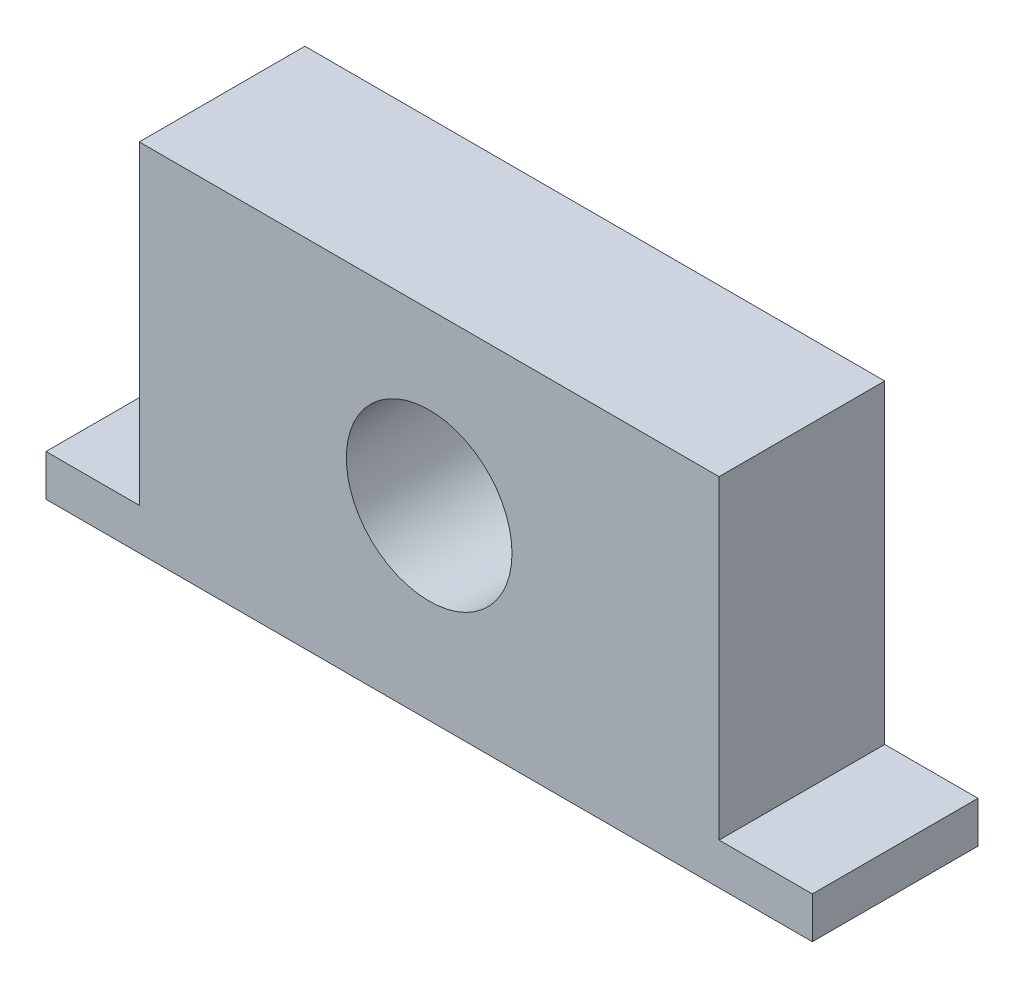
ISO-10303-21;
HEADER;
FILE_DESCRIPTION(('STEP AP214'),'2;1');
FILE_NAME('part.step','',(''),(''),'','','');
FILE_SCHEMA(('AUTOMOTIVE_DESIGN { 1 0 10303 214 1 1 1 1 }'));
ENDSEC;
DATA;
#1=APPLICATION_CONTEXT('core data for automotive mechanical design processes');
#2=APPLICATION_PROTOCOL_DEFINITION('international standard','automotive_design',2000,#1);
#3=PRODUCT_CONTEXT('',#1,'mechanical');
#4=PRODUCT('Part','Part','',(#3));
#5=PRODUCT_RELATED_PRODUCT_CATEGORY('part','',(#4));
#6=PRODUCT_DEFINITION_FORMATION('','',#4);
#7=PRODUCT_DEFINITION_CONTEXT('part definition',#1,'design');
#8=PRODUCT_DEFINITION('design','',#6,#7);
#9=PRODUCT_DEFINITION_SHAPE('','',#8);
#10=(LENGTH_UNIT() NAMED_UNIT(*) SI_UNIT(.MILLI.,.METRE.));
#11=(NAMED_UNIT(*) PLANE_ANGLE_UNIT() SI_UNIT($,.RADIAN.));
#12=(NAMED_UNIT(*) SI_UNIT($,.STERADIAN.) SOLID_ANGLE_UNIT());
#13=UNCERTAINTY_MEASURE_WITH_UNIT(LENGTH_MEASURE(1.E-05),#10,'distance_accuracy_value','');
#14=(GEOMETRIC_REPRESENTATION_CONTEXT(3) GLOBAL_UNCERTAINTY_ASSIGNED_CONTEXT((#13)) GLOBAL_UNIT_ASSIGNED_CONTEXT((#10,
#11,#12)) REPRESENTATION_CONTEXT('',''));
#15=CARTESIAN_POINT('',(0.,0.,0.));
#16=DIRECTION('',(0.,0.,1.));
#17=DIRECTION('',(1.,0.,0.));
#18=AXIS2_PLACEMENT_3D('',#15,#16,#17);
#19=CARTESIAN_POINT('',(0.,3.175,0.));
#20=DIRECTION('',(0.,-1.,0.));
#21=DIRECTION('',(0.,0.,-1.));
#22=AXIS2_PLACEMENT_3D('',#19,#20,#21);
#23=PLANE('',#22);
#24=DIRECTION('',(0.,0.,1.));
#25=VECTOR('',#24,1.);
#26=CARTESIAN_POINT('',(7.1501,3.175,0.));
#27=LINE('',#26,#25);
#28=CARTESIAN_POINT('',(7.1501,3.175,-12.7));
#29=VERTEX_POINT('',#28);
#30=CARTESIAN_POINT('',(7.1501,3.175,0.));
#31=VERTEX_POINT('',#30);
#32=EDGE_CURVE('E50',#29,#31,#27,.T.);
#33=ORIENTED_EDGE('',*,*,#32,.F.);
#34=DIRECTION('',(-1.,0.,0.));
#35=VECTOR('',#34,1.);
#36=CARTESIAN_POINT('',(0.,3.175,-12.7));
#37=LINE('',#36,#35);
#38=CARTESIAN_POINT('',(0.,3.175,-12.7));
#39=VERTEX_POINT('',#38);
#40=EDGE_CURVE('E147',#29,#39,#37,.T.);
#41=ORIENTED_EDGE('',*,*,#40,.T.);
#42=DIRECTION('',(0.,0.,1.));
#43=VECTOR('',#42,1.);
#44=CARTESIAN_POINT('',(0.,3.175,0.));
#45=LINE('',#44,#43);
#46=CARTESIAN_POINT('',(0.,3.175,0.));
#47=VERTEX_POINT('',#46);
#48=EDGE_CURVE('E142',#39,#47,#45,.T.);
#49=ORIENTED_EDGE('',*,*,#48,.T.);
#50=DIRECTION('',(1.,0.,0.));
#51=VECTOR('',#50,1.);
#52=CARTESIAN_POINT('',(0.,3.175,0.));
#53=LINE('',#52,#51);
#54=EDGE_CURVE('E213',#47,#31,#53,.T.);
#55=ORIENTED_EDGE('',*,*,#54,.T.);
#56=EDGE_LOOP('',(#33,#41,#49,#55));
#57=FACE_BOUND('',#56,.T.);
#58=ADVANCED_FACE('F33',(#57),#23,.F.);
#59=DIRECTION('',(0.,0.,-1.));
#60=VECTOR('',#59,1.);
#61=CARTESIAN_POINT('',(51.6001,3.175,0.));
#62=LINE('',#61,#60);
#63=CARTESIAN_POINT('',(51.6001,3.175,0.));
#64=VERTEX_POINT('',#63);
#65=CARTESIAN_POINT('',(51.6001,3.175,-12.7));
#66=VERTEX_POINT('',#65);
#67=EDGE_CURVE('E58',#64,#66,#62,.T.);
#68=ORIENTED_EDGE('',*,*,#67,.F.);
#69=CARTESIAN_POINT('',(58.7502,3.175,0.));
#70=VERTEX_POINT('',#69);
#71=EDGE_CURVE('E216',#64,#70,#53,.T.);
#72=ORIENTED_EDGE('',*,*,#71,.T.);
#73=DIRECTION('',(0.,0.,-1.));
#74=VECTOR('',#73,1.);
#75=CARTESIAN_POINT('',(58.7502,3.175,0.));
#76=LINE('',#75,#74);
#77=CARTESIAN_POINT('',(58.7502,3.175,-12.7));
#78=VERTEX_POINT('',#77);
#79=EDGE_CURVE('E215',#70,#78,#76,.T.);
#80=ORIENTED_EDGE('',*,*,#79,.T.);
#81=EDGE_CURVE('E225',#78,#66,#37,.T.);
#82=ORIENTED_EDGE('',*,*,#81,.T.);
#83=EDGE_LOOP('',(#68,#72,#80,#82));
#84=FACE_BOUND('',#83,.T.);
#85=ADVANCED_FACE('F175',(#84),#23,.F.);
#86=CARTESIAN_POINT('',(0.,3.175,0.));
#87=DIRECTION('',(1.,0.,0.));
#88=DIRECTION('',(0.,0.,-1.));
#89=AXIS2_PLACEMENT_3D('',#86,#87,#88);
#90=PLANE('',#89);
#91=DIRECTION('',(0.,0.,1.));
#92=VECTOR('',#91,1.);
#93=CARTESIAN_POINT('',(0.,0.,0.));
#94=LINE('',#93,#92);
#95=CARTESIAN_POINT('',(0.,0.,-12.7));
#96=VERTEX_POINT('',#95);
#97=CARTESIAN_POINT('',(0.,0.,0.));
#98=VERTEX_POINT('',#97);
#99=EDGE_CURVE('E121',#96,#98,#94,.T.);
#100=ORIENTED_EDGE('',*,*,#99,.T.);
#101=DIRECTION('',(0.,-1.,0.));
#102=VECTOR('',#101,1.);
#103=CARTESIAN_POINT('',(0.,3.175,0.));
#104=LINE('',#103,#102);
#105=EDGE_CURVE('E11',#47,#98,#104,.T.);
#106=ORIENTED_EDGE('',*,*,#105,.F.);
#107=ORIENTED_EDGE('',*,*,#48,.F.);
#108=DIRECTION('',(0.,-1.,0.));
#109=VECTOR('',#108,1.);
#110=CARTESIAN_POINT('',(0.,3.175,-12.7));
#111=LINE('',#110,#109);
#112=EDGE_CURVE('E205',#39,#96,#111,.T.);
#113=ORIENTED_EDGE('',*,*,#112,.T.);
#114=EDGE_LOOP('',(#100,#106,#107,#113));
#115=FACE_BOUND('',#114,.T.);
#116=ADVANCED_FACE('F35',(#115),#90,.F.);
#117=CARTESIAN_POINT('',(0.,3.175,0.));
#118=DIRECTION('',(0.,0.,-1.));
#119=DIRECTION('',(-1.,0.,0.));
#120=AXIS2_PLACEMENT_3D('',#117,#118,#119);
#121=PLANE('',#120);
#122=CARTESIAN_POINT('',(29.3751,14.2748,0.));
#123=DIRECTION('',(0.,0.,1.));
#124=DIRECTION('',(1.,0.,0.));
#125=AXIS2_PLACEMENT_3D('',#122,#123,#124);
#126=CIRCLE('',#125,6.35);
#127=CARTESIAN_POINT('',(35.7251,14.2748,0.));
#128=VERTEX_POINT('',#127);
#129=EDGE_CURVE('E157',#128,#128,#126,.T.);
#130=ORIENTED_EDGE('',*,*,#129,.F.);
#131=EDGE_LOOP('',(#130));
#132=FACE_BOUND('',#131,.T.);
#133=DIRECTION('',(1.,0.,0.));
#134=VECTOR('',#133,1.);
#135=CARTESIAN_POINT('',(0.,0.,0.));
#136=LINE('',#135,#134);
#137=CARTESIAN_POINT('',(58.7502,0.,0.));
#138=VERTEX_POINT('',#137);
#139=EDGE_CURVE('E124',#98,#138,#136,.T.);
#140=ORIENTED_EDGE('',*,*,#139,.T.);
#141=DIRECTION('',(0.,-1.,0.));
#142=VECTOR('',#141,1.);
#143=CARTESIAN_POINT('',(58.7502,3.175,0.));
#144=LINE('',#143,#142);
#145=EDGE_CURVE('E42',#70,#138,#144,.T.);
#146=ORIENTED_EDGE('',*,*,#145,.F.);
#147=ORIENTED_EDGE('',*,*,#71,.F.);
#148=DIRECTION('',(0.,-1.,0.));
#149=VECTOR('',#148,1.);
#150=CARTESIAN_POINT('',(51.6001,27.305,0.));
#151=LINE('',#150,#149);
#152=CARTESIAN_POINT('',(51.6001,27.305,0.));
#153=VERTEX_POINT('',#152);
#154=EDGE_CURVE('E106',#153,#64,#151,.T.);
#155=ORIENTED_EDGE('',*,*,#154,.F.);
#156=DIRECTION('',(1.,0.,0.));
#157=VECTOR('',#156,1.);
#158=CARTESIAN_POINT('',(7.1501,27.305,0.));
#159=LINE('',#158,#157);
#160=CARTESIAN_POINT('',(7.1501,27.305,0.));
#161=VERTEX_POINT('',#160);
#162=EDGE_CURVE('E100',#161,#153,#159,.T.);
#163=ORIENTED_EDGE('',*,*,#162,.F.);
#164=DIRECTION('',(0.,-1.,0.));
#165=VECTOR('',#164,1.);
#166=CARTESIAN_POINT('',(7.1501,27.305,0.));
#167=LINE('',#166,#165);
#168=EDGE_CURVE('E104',#161,#31,#167,.T.);
#169=ORIENTED_EDGE('',*,*,#168,.T.);
#170=ORIENTED_EDGE('',*,*,#54,.F.);
#171=ORIENTED_EDGE('',*,*,#105,.T.);
#172=EDGE_LOOP('',(#140,#146,#147,#155,#163,#169,#170,#171));
#173=FACE_BOUND('',#172,.T.);
#174=ADVANCED_FACE('F102',(#132,#173),#121,.F.);
#175=CARTESIAN_POINT('',(58.7502,3.175,0.));
#176=DIRECTION('',(-1.,0.,0.));
#177=DIRECTION('',(0.,0.,1.));
#178=AXIS2_PLACEMENT_3D('',#175,#176,#177);
#179=PLANE('',#178);
#180=DIRECTION('',(0.,0.,-1.));
#181=VECTOR('',#180,1.);
#182=CARTESIAN_POINT('',(58.7502,0.,0.));
#183=LINE('',#182,#181);
#184=CARTESIAN_POINT('',(58.7502,0.,-12.7));
#185=VERTEX_POINT('',#184);
#186=EDGE_CURVE('E209',#138,#185,#183,.T.);
#187=ORIENTED_EDGE('',*,*,#186,.T.);
#188=DIRECTION('',(0.,-1.,0.));
#189=VECTOR('',#188,1.);
#190=CARTESIAN_POINT('',(58.7502,3.175,-12.7));
#191=LINE('',#190,#189);
#192=EDGE_CURVE('E224',#78,#185,#191,.T.);
#193=ORIENTED_EDGE('',*,*,#192,.F.);
#194=ORIENTED_EDGE('',*,*,#79,.F.);
#195=ORIENTED_EDGE('',*,*,#145,.T.);
#196=EDGE_LOOP('',(#187,#193,#194,#195));
#197=FACE_BOUND('',#196,.T.);
#198=ADVANCED_FACE('F189',(#197),#179,.F.);
#199=CARTESIAN_POINT('',(0.,3.175,-12.7));
#200=DIRECTION('',(0.,0.,1.));
#201=DIRECTION('',(1.,0.,0.));
#202=AXIS2_PLACEMENT_3D('',#199,#200,#201);
#203=PLANE('',#202);
#204=CARTESIAN_POINT('',(29.3751,14.2748,-12.7));
#205=DIRECTION('',(0.,0.,1.));
#206=DIRECTION('',(1.,0.,0.));
#207=AXIS2_PLACEMENT_3D('',#204,#205,#206);
#208=CIRCLE('',#207,6.35);
#209=CARTESIAN_POINT('',(35.7251,14.2748,-12.7));
#210=VERTEX_POINT('',#209);
#211=EDGE_CURVE('E37',#210,#210,#208,.T.);
#212=ORIENTED_EDGE('',*,*,#211,.T.);
#213=EDGE_LOOP('',(#212));
#214=FACE_BOUND('',#213,.T.);
#215=DIRECTION('',(-1.,0.,0.));
#216=VECTOR('',#215,1.);
#217=CARTESIAN_POINT('',(0.,0.,-12.7));
#218=LINE('',#217,#216);
#219=EDGE_CURVE('E208',#185,#96,#218,.T.);
#220=ORIENTED_EDGE('',*,*,#219,.T.);
#221=ORIENTED_EDGE('',*,*,#112,.F.);
#222=ORIENTED_EDGE('',*,*,#40,.F.);
#223=DIRECTION('',(0.,-1.,0.));
#224=VECTOR('',#223,1.);
#225=CARTESIAN_POINT('',(7.1501,27.305,-12.7));
#226=LINE('',#225,#224);
#227=CARTESIAN_POINT('',(7.1501,27.305,-12.7));
#228=VERTEX_POINT('',#227);
#229=EDGE_CURVE('E135',#228,#29,#226,.T.);
#230=ORIENTED_EDGE('',*,*,#229,.F.);
#231=DIRECTION('',(-1.,0.,0.));
#232=VECTOR('',#231,1.);
#233=CARTESIAN_POINT('',(7.1501,27.305,-12.7));
#234=LINE('',#233,#232);
#235=CARTESIAN_POINT('',(51.6001,27.305,-12.7));
#236=VERTEX_POINT('',#235);
#237=EDGE_CURVE('E115',#236,#228,#234,.T.);
#238=ORIENTED_EDGE('',*,*,#237,.F.);
#239=DIRECTION('',(0.,-1.,0.));
#240=VECTOR('',#239,1.);
#241=CARTESIAN_POINT('',(51.6001,27.305,-12.7));
#242=LINE('',#241,#240);
#243=EDGE_CURVE('E126',#236,#66,#242,.T.);
#244=ORIENTED_EDGE('',*,*,#243,.T.);
#245=ORIENTED_EDGE('',*,*,#81,.F.);
#246=ORIENTED_EDGE('',*,*,#192,.T.);
#247=EDGE_LOOP('',(#220,#221,#222,#230,#238,#244,#245,#246));
#248=FACE_BOUND('',#247,.T.);
#249=ADVANCED_FACE('F164',(#214,#248),#203,.F.);
#250=CARTESIAN_POINT('',(0.,0.,0.));
#251=DIRECTION('',(0.,-1.,0.));
#252=DIRECTION('',(0.,0.,-1.));
#253=AXIS2_PLACEMENT_3D('',#250,#251,#252);
#254=PLANE('',#253);
#255=ORIENTED_EDGE('',*,*,#99,.F.);
#256=ORIENTED_EDGE('',*,*,#219,.F.);
#257=ORIENTED_EDGE('',*,*,#186,.F.);
#258=ORIENTED_EDGE('',*,*,#139,.F.);
#259=EDGE_LOOP('',(#255,#256,#257,#258));
#260=FACE_BOUND('',#259,.T.);
#261=ADVANCED_FACE('F183',(#260),#254,.T.);
#262=CARTESIAN_POINT('',(7.1501,27.305,0.));
#263=DIRECTION('',(1.,0.,0.));
#264=DIRECTION('',(0.,0.,-1.));
#265=AXIS2_PLACEMENT_3D('',#262,#263,#264);
#266=PLANE('',#265);
#267=ORIENTED_EDGE('',*,*,#32,.T.);
#268=ORIENTED_EDGE('',*,*,#168,.F.);
#269=DIRECTION('',(0.,0.,1.));
#270=VECTOR('',#269,1.);
#271=CARTESIAN_POINT('',(7.1501,27.305,0.));
#272=LINE('',#271,#270);
#273=EDGE_CURVE('E110',#228,#161,#272,.T.);
#274=ORIENTED_EDGE('',*,*,#273,.F.);
#275=ORIENTED_EDGE('',*,*,#229,.T.);
#276=EDGE_LOOP('',(#267,#268,#274,#275));
#277=FACE_BOUND('',#276,.T.);
#278=ADVANCED_FACE('F120',(#277),#266,.F.);
#279=CARTESIAN_POINT('',(51.6001,27.305,0.));
#280=DIRECTION('',(-1.,0.,0.));
#281=DIRECTION('',(0.,0.,1.));
#282=AXIS2_PLACEMENT_3D('',#279,#280,#281);
#283=PLANE('',#282);
#284=ORIENTED_EDGE('',*,*,#67,.T.);
#285=ORIENTED_EDGE('',*,*,#243,.F.);
#286=DIRECTION('',(0.,0.,-1.));
#287=VECTOR('',#286,1.);
#288=CARTESIAN_POINT('',(51.6001,27.305,0.));
#289=LINE('',#288,#287);
#290=EDGE_CURVE('E109',#153,#236,#289,.T.);
#291=ORIENTED_EDGE('',*,*,#290,.F.);
#292=ORIENTED_EDGE('',*,*,#154,.T.);
#293=EDGE_LOOP('',(#284,#285,#291,#292));
#294=FACE_BOUND('',#293,.T.);
#295=ADVANCED_FACE('F172',(#294),#283,.F.);
#296=CARTESIAN_POINT('',(0.,27.305,0.));
#297=DIRECTION('',(0.,-1.,0.));
#298=DIRECTION('',(0.,0.,-1.));
#299=AXIS2_PLACEMENT_3D('',#296,#297,#298);
#300=PLANE('',#299);
#301=ORIENTED_EDGE('',*,*,#273,.T.);
#302=ORIENTED_EDGE('',*,*,#162,.T.);
#303=ORIENTED_EDGE('',*,*,#290,.T.);
#304=ORIENTED_EDGE('',*,*,#237,.T.);
#305=EDGE_LOOP('',(#301,#302,#303,#304));
#306=FACE_BOUND('',#305,.T.);
#307=ADVANCED_FACE('F113',(#306),#300,.F.);
#308=CARTESIAN_POINT('',(29.3751,14.2748,-24.13));
#309=DIRECTION('',(0.,0.,1.));
#310=DIRECTION('',(1.,0.,0.));
#311=AXIS2_PLACEMENT_3D('',#308,#309,#310);
#312=CYLINDRICAL_SURFACE('',#311,6.35);
#313=CARTESIAN_POINT('',(35.7251,14.2748,0.));
#314=CARTESIAN_POINT('',(35.7251,14.2748,-0.132291666666671));
#315=CARTESIAN_POINT('',(35.7251,14.2748,-0.264583333333338));
#316=CARTESIAN_POINT('',(35.7251,14.2748,-0.529166666666671));
#317=CARTESIAN_POINT('',(35.7251,14.2748,-0.661458333333337));
#318=CARTESIAN_POINT('',(35.7251,14.2748,-0.92604166666667));
#319=CARTESIAN_POINT('',(35.7251,14.2748,-1.05833333333334));
#320=CARTESIAN_POINT('',(35.7251,14.2748,-1.32291666666667));
#321=CARTESIAN_POINT('',(35.7251,14.2748,-1.45520833333334));
#322=CARTESIAN_POINT('',(35.7251,14.2748,-1.71979166666667));
#323=CARTESIAN_POINT('',(35.7251,14.2748,-1.85208333333334));
#324=CARTESIAN_POINT('',(35.7251,14.2748,-2.11666666666667));
#325=CARTESIAN_POINT('',(35.7251,14.2748,-2.24895833333334));
#326=CARTESIAN_POINT('',(35.7251,14.2748,-2.51354166666667));
#327=CARTESIAN_POINT('',(35.7251,14.2748,-2.64583333333334));
#328=CARTESIAN_POINT('',(35.7251,14.2748,-2.91041666666667));
#329=CARTESIAN_POINT('',(35.7251,14.2748,-3.04270833333334));
#330=CARTESIAN_POINT('',(35.7251,14.2748,-3.30729166666667));
#331=CARTESIAN_POINT('',(35.7251,14.2748,-3.43958333333334));
#332=CARTESIAN_POINT('',(35.7251,14.2748,-3.70416666666667));
#333=CARTESIAN_POINT('',(35.7251,14.2748,-3.83645833333334));
#334=CARTESIAN_POINT('',(35.7251,14.2748,-4.10104166666667));
#335=CARTESIAN_POINT('',(35.7251,14.2748,-4.23333333333334));
#336=CARTESIAN_POINT('',(35.7251,14.2748,-4.49791666666667));
#337=CARTESIAN_POINT('',(35.7251,14.2748,-4.63020833333334));
#338=CARTESIAN_POINT('',(35.7251,14.2748,-4.89479166666667));
#339=CARTESIAN_POINT('',(35.7251,14.2748,-5.02708333333334));
#340=CARTESIAN_POINT('',(35.7251,14.2748,-5.29166666666667));
#341=CARTESIAN_POINT('',(35.7251,14.2748,-5.42395833333334));
#342=CARTESIAN_POINT('',(35.7251,14.2748,-5.68854166666667));
#343=CARTESIAN_POINT('',(35.7251,14.2748,-5.82083333333334));
#344=CARTESIAN_POINT('',(35.7251,14.2748,-6.08541666666667));
#345=CARTESIAN_POINT('',(35.7251,14.2748,-6.21770833333334));
#346=CARTESIAN_POINT('',(35.7251,14.2748,-6.48229166666667));
#347=CARTESIAN_POINT('',(35.7251,14.2748,-6.61458333333334));
#348=CARTESIAN_POINT('',(35.7251,14.2748,-6.87916666666667));
#349=CARTESIAN_POINT('',(35.7251,14.2748,-7.01145833333334));
#350=CARTESIAN_POINT('',(35.7251,14.2748,-7.27604166666667));
#351=CARTESIAN_POINT('',(35.7251,14.2748,-7.40833333333334));
#352=CARTESIAN_POINT('',(35.7251,14.2748,-7.67291666666667));
#353=CARTESIAN_POINT('',(35.7251,14.2748,-7.80520833333334));
#354=CARTESIAN_POINT('',(35.7251,14.2748,-8.06979166666667));
#355=CARTESIAN_POINT('',(35.7251,14.2748,-8.20208333333334));
#356=CARTESIAN_POINT('',(35.7251,14.2748,-8.46666666666667));
#357=CARTESIAN_POINT('',(35.7251,14.2748,-8.59895833333334));
#358=CARTESIAN_POINT('',(35.7251,14.2748,-8.86354166666667));
#359=CARTESIAN_POINT('',(35.7251,14.2748,-8.99583333333334));
#360=CARTESIAN_POINT('',(35.7251,14.2748,-9.26041666666667));
#361=CARTESIAN_POINT('',(35.7251,14.2748,-9.39270833333333));
#362=CARTESIAN_POINT('',(35.7251,14.2748,-9.65729166666667));
#363=CARTESIAN_POINT('',(35.7251,14.2748,-9.78958333333333));
#364=CARTESIAN_POINT('',(35.7251,14.2748,-10.0541666666667));
#365=CARTESIAN_POINT('',(35.7251,14.2748,-10.1864583333333));
#366=CARTESIAN_POINT('',(35.7251,14.2748,-10.4510416666667));
#367=CARTESIAN_POINT('',(35.7251,14.2748,-10.5833333333333));
#368=CARTESIAN_POINT('',(35.7251,14.2748,-10.8479166666667));
#369=CARTESIAN_POINT('',(35.7251,14.2748,-10.9802083333333));
#370=CARTESIAN_POINT('',(35.7251,14.2748,-11.2447916666667));
#371=CARTESIAN_POINT('',(35.7251,14.2748,-11.3770833333333));
#372=CARTESIAN_POINT('',(35.7251,14.2748,-11.6416666666667));
#373=CARTESIAN_POINT('',(35.7251,14.2748,-11.7739583333333));
#374=CARTESIAN_POINT('',(35.7251,14.2748,-12.0385416666667));
#375=CARTESIAN_POINT('',(35.7251,14.2748,-12.1708333333333));
#376=CARTESIAN_POINT('',(35.7251,14.2748,-12.4354166666667));
#377=CARTESIAN_POINT('',(35.7251,14.2748,-12.5677083333333));
#378=CARTESIAN_POINT('',(35.7251,14.2748,-12.7));
#379=B_SPLINE_CURVE_WITH_KNOTS('',3,(#313,#314,#315,#316,#317,#318,#319,#320,#321,#322,#323,
#324,#325,#326,#327,#328,#329,#330,#331,#332,#333,#334,#335,#336,#337,#338,#339,#340,#341,#342,
#343,#344,#345,#346,#347,#348,#349,#350,#351,#352,#353,#354,#355,#356,#357,#358,#359,#360,#361,
#362,#363,#364,#365,#366,#367,#368,#369,#370,#371,#372,#373,#374,#375,#376,#377,#378),
.UNSPECIFIED.,.F.,.F.,(4,2,2,2,2,2,2,2,2,2,2,2,2,2,2,2,2,2,2,2,2,2,2,2,2,2,2,2,2,2,2,2,4),(0.,
0.396875000000001,0.793749999999999,1.190625,1.5875,1.984375,2.38125,2.778125,3.175,3.571875,
3.96875,4.365625,4.7625,5.159375,5.55625,5.953125,6.35,6.746875,7.14375,7.540625,7.9375,
8.334375,8.73125,9.128125,9.525,9.921875,10.31875,10.715625,11.1125,11.509375,11.90625,
12.303125,12.7),.UNSPECIFIED.);
#380=EDGE_CURVE('BSEAM166',#128,#210,#379,.T.);
#381=ORIENTED_EDGE('',*,*,#129,.T.);
#382=ORIENTED_EDGE('',*,*,#211,.F.);
#383=ORIENTED_EDGE('',*,*,#380,.T.);
#384=ORIENTED_EDGE('',*,*,#380,.F.);
#385=EDGE_LOOP('',(#381,#383,#382,#384));
#386=FACE_BOUND('',#385,.T.);
#387=ADVANCED_FACE('F166',(#386),#312,.F.);
#388=CLOSED_SHELL('',(#58,#85,#116,#174,#198,#249,#261,#278,#295,#307,#387));
#389=MANIFOLD_SOLID_BREP('B2',#388);
#390=ADVANCED_BREP_SHAPE_REPRESENTATION('',(#18,#389),#14);
#391=SHAPE_DEFINITION_REPRESENTATION(#9,#390);
ENDSEC;
END-ISO-10303-21;
